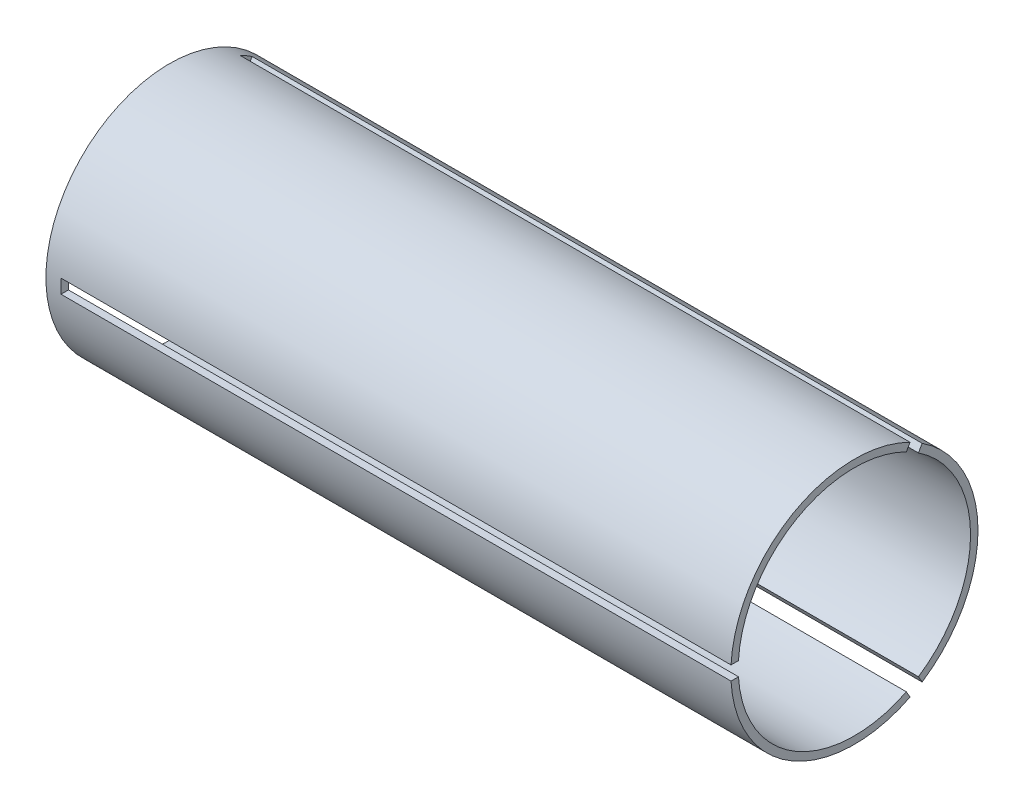
ISO-10303-21;
HEADER;
FILE_DESCRIPTION(('STEP AP214'),'2;1');
FILE_NAME('part.step','',(''),(''),'','','');
FILE_SCHEMA(('AUTOMOTIVE_DESIGN { 1 0 10303 214 1 1 1 1 }'));
ENDSEC;
DATA;
#1=APPLICATION_CONTEXT('core data for automotive mechanical design processes');
#2=APPLICATION_PROTOCOL_DEFINITION('international standard','automotive_design',2000,#1);
#3=PRODUCT_CONTEXT('',#1,'mechanical');
#4=PRODUCT('Part','Part','',(#3));
#5=PRODUCT_RELATED_PRODUCT_CATEGORY('part','',(#4));
#6=PRODUCT_DEFINITION_FORMATION('','',#4);
#7=PRODUCT_DEFINITION_CONTEXT('part definition',#1,'design');
#8=PRODUCT_DEFINITION('design','',#6,#7);
#9=PRODUCT_DEFINITION_SHAPE('','',#8);
#10=(LENGTH_UNIT() NAMED_UNIT(*) SI_UNIT(.MILLI.,.METRE.));
#11=(NAMED_UNIT(*) PLANE_ANGLE_UNIT() SI_UNIT($,.RADIAN.));
#12=(NAMED_UNIT(*) SI_UNIT($,.STERADIAN.) SOLID_ANGLE_UNIT());
#13=UNCERTAINTY_MEASURE_WITH_UNIT(LENGTH_MEASURE(1.E-05),#10,'distance_accuracy_value','');
#14=(GEOMETRIC_REPRESENTATION_CONTEXT(3) GLOBAL_UNCERTAINTY_ASSIGNED_CONTEXT((#13)) GLOBAL_UNIT_ASSIGNED_CONTEXT((#10,
#11,#12)) REPRESENTATION_CONTEXT('',''));
#15=CARTESIAN_POINT('',(0.,0.,0.));
#16=DIRECTION('',(0.,0.,1.));
#17=DIRECTION('',(1.,0.,0.));
#18=AXIS2_PLACEMENT_3D('',#15,#16,#17);
#19=CARTESIAN_POINT('',(233.68,0.,0.));
#20=DIRECTION('',(1.,0.,0.));
#21=DIRECTION('',(0.,0.,-1.));
#22=AXIS2_PLACEMENT_3D('',#19,#20,#21);
#23=PLANE('',#22);
#24=CARTESIAN_POINT('',(233.68,0.,0.));
#25=DIRECTION('',(1.,0.,0.));
#26=DIRECTION('',(0.,0.,-1.));
#27=AXIS2_PLACEMENT_3D('',#24,#25,#26);
#28=CIRCLE('',#27,39.624);
#29=CARTESIAN_POINT('',(233.68,-33.0627437150347,-21.8384146410387));
#30=VERTEX_POINT('',#29);
#31=CARTESIAN_POINT('',(233.68,33.062743715035,-21.8384146410382));
#32=VERTEX_POINT('',#31);
#33=EDGE_CURVE('E261',#30,#32,#28,.T.);
#34=ORIENTED_EDGE('',*,*,#33,.F.);
#35=DIRECTION('',(0.,0.866025403784436,0.500000000000004));
#36=VECTOR('',#35,1.);
#37=CARTESIAN_POINT('',(233.68,-48.6899225625834,-30.8607705553455));
#38=LINE('',#37,#36);
#39=CARTESIAN_POINT('',(233.68,-35.2661906635782,-23.1105753299253));
#40=VERTEX_POINT('',#39);
#41=EDGE_CURVE('E222',#40,#30,#38,.T.);
#42=ORIENTED_EDGE('',*,*,#41,.F.);
#43=CARTESIAN_POINT('',(233.68,0.,0.));
#44=DIRECTION('',(1.,0.,0.));
#45=DIRECTION('',(0.,0.,-1.));
#46=AXIS2_PLACEMENT_3D('',#43,#44,#45);
#47=CIRCLE('',#46,42.164);
#48=CARTESIAN_POINT('',(233.68,35.2661906635785,-23.1105753299248));
#49=VERTEX_POINT('',#48);
#50=EDGE_CURVE('E160',#40,#49,#47,.T.);
#51=ORIENTED_EDGE('',*,*,#50,.T.);
#52=DIRECTION('',(0.,-0.866025403784443,0.499999999999992));
#53=VECTOR('',#52,1.);
#54=CARTESIAN_POINT('',(233.68,48.6899225625837,-30.8607705553447));
#55=LINE('',#54,#53);
#56=EDGE_CURVE('E153',#49,#32,#55,.T.);
#57=ORIENTED_EDGE('',*,*,#56,.T.);
#58=EDGE_LOOP('',(#34,#42,#51,#57));
#59=FACE_BOUND('',#58,.T.);
#60=ADVANCED_FACE('F45',(#59),#23,.T.);
#61=CARTESIAN_POINT('',(233.68,-2.38125000000001,42.096704674327));
#62=VERTEX_POINT('',#61);
#63=CARTESIAN_POINT('',(233.68,-37.6474406635782,-18.986129344402));
#64=VERTEX_POINT('',#63);
#65=EDGE_CURVE('E163',#62,#64,#47,.T.);
#66=ORIENTED_EDGE('',*,*,#65,.T.);
#67=DIRECTION('',(0.,0.866025403784436,0.500000000000004));
#68=VECTOR('',#67,1.);
#69=CARTESIAN_POINT('',(233.68,-51.0711725625835,-26.7363245698221));
#70=LINE('',#69,#68);
#71=CARTESIAN_POINT('',(233.68,-35.4439937150347,-17.7139686555153));
#72=VERTEX_POINT('',#71);
#73=EDGE_CURVE('E284',#64,#72,#70,.T.);
#74=ORIENTED_EDGE('',*,*,#73,.T.);
#75=CARTESIAN_POINT('',(233.68,-2.38125000000001,39.5523832965537));
#76=VERTEX_POINT('',#75);
#77=EDGE_CURVE('E168',#76,#72,#28,.T.);
#78=ORIENTED_EDGE('',*,*,#77,.F.);
#79=DIRECTION('',(0.,0.,-1.));
#80=VECTOR('',#79,1.);
#81=CARTESIAN_POINT('',(233.68,-2.38125000000001,42.164));
#82=LINE('',#81,#80);
#83=EDGE_CURVE('E240',#62,#76,#82,.T.);
#84=ORIENTED_EDGE('',*,*,#83,.F.);
#85=EDGE_LOOP('',(#66,#74,#78,#84));
#86=FACE_BOUND('',#85,.T.);
#87=ADVANCED_FACE('F305',(#86),#23,.T.);
#88=CARTESIAN_POINT('',(233.68,35.443993715035,-17.7139686555148));
#89=VERTEX_POINT('',#88);
#90=CARTESIAN_POINT('',(233.68,2.38124999999999,39.5523832965537));
#91=VERTEX_POINT('',#90);
#92=EDGE_CURVE('E151',#89,#91,#28,.T.);
#93=ORIENTED_EDGE('',*,*,#92,.F.);
#94=DIRECTION('',(0.,-0.866025403784443,0.499999999999992));
#95=VECTOR('',#94,1.);
#96=CARTESIAN_POINT('',(233.68,51.0711725625837,-26.7363245698213));
#97=LINE('',#96,#95);
#98=CARTESIAN_POINT('',(233.68,37.6474406635784,-18.9861293444014));
#99=VERTEX_POINT('',#98);
#100=EDGE_CURVE('E69',#99,#89,#97,.T.);
#101=ORIENTED_EDGE('',*,*,#100,.F.);
#102=CARTESIAN_POINT('',(233.68,2.38124999999999,42.096704674327));
#103=VERTEX_POINT('',#102);
#104=EDGE_CURVE('E149',#99,#103,#47,.T.);
#105=ORIENTED_EDGE('',*,*,#104,.T.);
#106=DIRECTION('',(0.,0.,-1.));
#107=VECTOR('',#106,1.);
#108=CARTESIAN_POINT('',(233.68,2.38124999999999,42.164));
#109=LINE('',#108,#107);
#110=EDGE_CURVE('E237',#103,#91,#109,.T.);
#111=ORIENTED_EDGE('',*,*,#110,.T.);
#112=EDGE_LOOP('',(#93,#101,#105,#111));
#113=FACE_BOUND('',#112,.T.);
#114=ADVANCED_FACE('F147',(#113),#23,.T.);
#115=CARTESIAN_POINT('',(233.68,0.,0.));
#116=DIRECTION('',(-1.,0.,0.));
#117=DIRECTION('',(0.,0.,1.));
#118=AXIS2_PLACEMENT_3D('',#115,#116,#117);
#119=CYLINDRICAL_SURFACE('',#118,42.164);
#120=CARTESIAN_POINT('',(0.,0.,0.));
#121=DIRECTION('',(1.,0.,0.));
#122=DIRECTION('',(0.,0.,-1.));
#123=AXIS2_PLACEMENT_3D('',#120,#121,#122);
#124=CIRCLE('',#123,42.164);
#125=CARTESIAN_POINT('',(0.,0.,-42.164));
#126=VERTEX_POINT('',#125);
#127=EDGE_CURVE('E161',#126,#126,#124,.T.);
#128=ORIENTED_EDGE('',*,*,#127,.T.);
#129=EDGE_LOOP('',(#128));
#130=FACE_BOUND('',#129,.T.);
#131=DIRECTION('',(-1.,0.,0.));
#132=VECTOR('',#131,1.);
#133=CARTESIAN_POINT('',(233.68,-35.2661906635782,-23.1105753299253));
#134=LINE('',#133,#132);
#135=CARTESIAN_POINT('',(5.07999999999997,-35.2661906635781,-23.1105753299254));
#136=VERTEX_POINT('',#135);
#137=EDGE_CURVE('E234',#136,#40,#134,.F.);
#138=ORIENTED_EDGE('',*,*,#137,.F.);
#139=CARTESIAN_POINT('',(5.07999999999997,0.,0.));
#140=DIRECTION('',(1.,0.,0.));
#141=DIRECTION('',(0.,0.,-1.));
#142=AXIS2_PLACEMENT_3D('',#139,#140,#141);
#143=CIRCLE('',#142,42.164);
#144=CARTESIAN_POINT('',(5.07999999999997,-37.6474406635782,-18.986129344402));
#145=VERTEX_POINT('',#144);
#146=EDGE_CURVE('E228',#145,#136,#143,.T.);
#147=ORIENTED_EDGE('',*,*,#146,.F.);
#148=DIRECTION('',(-1.,0.,0.));
#149=VECTOR('',#148,1.);
#150=CARTESIAN_POINT('',(233.68,-37.6474406635782,-18.986129344402));
#151=LINE('',#150,#149);
#152=EDGE_CURVE('E218',#64,#145,#151,.T.);
#153=ORIENTED_EDGE('',*,*,#152,.F.);
#154=ORIENTED_EDGE('',*,*,#65,.F.);
#155=DIRECTION('',(-1.,0.,0.));
#156=VECTOR('',#155,1.);
#157=CARTESIAN_POINT('',(233.68,-2.38125000000001,42.096704674327));
#158=LINE('',#157,#156);
#159=CARTESIAN_POINT('',(5.07999999999997,-2.38125000000003,42.096704674327));
#160=VERTEX_POINT('',#159);
#161=EDGE_CURVE('E251',#160,#62,#158,.F.);
#162=ORIENTED_EDGE('',*,*,#161,.F.);
#163=CARTESIAN_POINT('',(5.07999999999997,0.,0.));
#164=DIRECTION('',(1.,0.,0.));
#165=DIRECTION('',(0.,0.,-1.));
#166=AXIS2_PLACEMENT_3D('',#163,#164,#165);
#167=CIRCLE('',#166,42.164);
#168=CARTESIAN_POINT('',(5.07999999999997,2.38124999999997,42.096704674327));
#169=VERTEX_POINT('',#168);
#170=EDGE_CURVE('E254',#169,#160,#167,.T.);
#171=ORIENTED_EDGE('',*,*,#170,.F.);
#172=DIRECTION('',(-1.,0.,0.));
#173=VECTOR('',#172,1.);
#174=CARTESIAN_POINT('',(233.68,2.38124999999999,42.096704674327));
#175=LINE('',#174,#173);
#176=EDGE_CURVE('E158',#103,#169,#175,.T.);
#177=ORIENTED_EDGE('',*,*,#176,.F.);
#178=ORIENTED_EDGE('',*,*,#104,.F.);
#179=DIRECTION('',(-1.,0.,0.));
#180=VECTOR('',#179,1.);
#181=CARTESIAN_POINT('',(233.68,37.6474406635784,-18.9861293444014));
#182=LINE('',#181,#180);
#183=CARTESIAN_POINT('',(5.07999999999997,37.6474406635785,-18.9861293444014));
#184=VERTEX_POINT('',#183);
#185=EDGE_CURVE('E134',#184,#99,#182,.F.);
#186=ORIENTED_EDGE('',*,*,#185,.F.);
#187=CARTESIAN_POINT('',(5.07999999999997,35.2661906635785,-23.1105753299248));
#188=VERTEX_POINT('',#187);
#189=EDGE_CURVE('E231',#188,#184,#143,.T.);
#190=ORIENTED_EDGE('',*,*,#189,.F.);
#191=DIRECTION('',(-1.,0.,0.));
#192=VECTOR('',#191,1.);
#193=CARTESIAN_POINT('',(233.68,35.2661906635785,-23.1105753299248));
#194=LINE('',#193,#192);
#195=EDGE_CURVE('E142',#49,#188,#194,.T.);
#196=ORIENTED_EDGE('',*,*,#195,.F.);
#197=ORIENTED_EDGE('',*,*,#50,.F.);
#198=EDGE_LOOP('',(#138,#147,#153,#154,#162,#171,#177,#178,#186,#190,#196,#197));
#199=FACE_BOUND('',#198,.T.);
#200=ADVANCED_FACE('F47',(#130,#199),#119,.T.);
#201=CARTESIAN_POINT('',(233.68,0.,0.));
#202=DIRECTION('',(-1.,0.,0.));
#203=DIRECTION('',(0.,0.,1.));
#204=AXIS2_PLACEMENT_3D('',#201,#202,#203);
#205=CYLINDRICAL_SURFACE('',#204,39.624);
#206=CARTESIAN_POINT('',(0.,0.,0.));
#207=DIRECTION('',(1.,0.,0.));
#208=DIRECTION('',(0.,0.,-1.));
#209=AXIS2_PLACEMENT_3D('',#206,#207,#208);
#210=CIRCLE('',#209,39.624);
#211=CARTESIAN_POINT('',(0.,0.,-39.624));
#212=VERTEX_POINT('',#211);
#213=EDGE_CURVE('E259',#212,#212,#210,.T.);
#214=ORIENTED_EDGE('',*,*,#213,.F.);
#215=EDGE_LOOP('',(#214));
#216=FACE_BOUND('',#215,.T.);
#217=CARTESIAN_POINT('',(5.07999999999997,0.,0.));
#218=DIRECTION('',(1.,0.,0.));
#219=DIRECTION('',(0.,0.,-1.));
#220=AXIS2_PLACEMENT_3D('',#217,#218,#219);
#221=CIRCLE('',#220,39.624);
#222=CARTESIAN_POINT('',(5.07999999999997,-35.4439937150347,-17.7139686555154));
#223=VERTEX_POINT('',#222);
#224=CARTESIAN_POINT('',(5.07999999999997,-33.0627437150347,-21.8384146410387));
#225=VERTEX_POINT('',#224);
#226=EDGE_CURVE('E201',#223,#225,#221,.T.);
#227=ORIENTED_EDGE('',*,*,#226,.T.);
#228=DIRECTION('',(-1.,0.,0.));
#229=VECTOR('',#228,1.);
#230=CARTESIAN_POINT('',(233.68,-33.0627437150347,-21.8384146410387));
#231=LINE('',#230,#229);
#232=EDGE_CURVE('E11',#225,#30,#231,.F.);
#233=ORIENTED_EDGE('',*,*,#232,.T.);
#234=ORIENTED_EDGE('',*,*,#33,.T.);
#235=DIRECTION('',(-1.,0.,0.));
#236=VECTOR('',#235,1.);
#237=CARTESIAN_POINT('',(233.68,33.062743715035,-21.8384146410382));
#238=LINE('',#237,#236);
#239=CARTESIAN_POINT('',(5.07999999999997,33.062743715035,-21.8384146410382));
#240=VERTEX_POINT('',#239);
#241=EDGE_CURVE('E200',#32,#240,#238,.T.);
#242=ORIENTED_EDGE('',*,*,#241,.T.);
#243=CARTESIAN_POINT('',(5.07999999999997,35.443993715035,-17.7139686555148));
#244=VERTEX_POINT('',#243);
#245=EDGE_CURVE('E196',#240,#244,#221,.T.);
#246=ORIENTED_EDGE('',*,*,#245,.T.);
#247=DIRECTION('',(-1.,0.,0.));
#248=VECTOR('',#247,1.);
#249=CARTESIAN_POINT('',(233.68,35.443993715035,-17.7139686555148));
#250=LINE('',#249,#248);
#251=EDGE_CURVE('E193',#244,#89,#250,.F.);
#252=ORIENTED_EDGE('',*,*,#251,.T.);
#253=ORIENTED_EDGE('',*,*,#92,.T.);
#254=DIRECTION('',(-1.,0.,0.));
#255=VECTOR('',#254,1.);
#256=CARTESIAN_POINT('',(233.68,2.38124999999999,39.5523832965537));
#257=LINE('',#256,#255);
#258=CARTESIAN_POINT('',(5.07999999999997,2.38124999999997,39.5523832965537));
#259=VERTEX_POINT('',#258);
#260=EDGE_CURVE('E187',#91,#259,#257,.T.);
#261=ORIENTED_EDGE('',*,*,#260,.T.);
#262=CARTESIAN_POINT('',(5.07999999999997,0.,0.));
#263=DIRECTION('',(1.,0.,0.));
#264=DIRECTION('',(0.,0.,-1.));
#265=AXIS2_PLACEMENT_3D('',#262,#263,#264);
#266=CIRCLE('',#265,39.624);
#267=CARTESIAN_POINT('',(5.07999999999997,-2.38125000000003,39.5523832965537));
#268=VERTEX_POINT('',#267);
#269=EDGE_CURVE('E180',#259,#268,#266,.T.);
#270=ORIENTED_EDGE('',*,*,#269,.T.);
#271=DIRECTION('',(-1.,0.,0.));
#272=VECTOR('',#271,1.);
#273=CARTESIAN_POINT('',(233.68,-2.38125000000001,39.5523832965537));
#274=LINE('',#273,#272);
#275=EDGE_CURVE('E173',#268,#76,#274,.F.);
#276=ORIENTED_EDGE('',*,*,#275,.T.);
#277=ORIENTED_EDGE('',*,*,#77,.T.);
#278=DIRECTION('',(-1.,0.,0.));
#279=VECTOR('',#278,1.);
#280=CARTESIAN_POINT('',(233.68,-35.4439937150347,-17.7139686555153));
#281=LINE('',#280,#279);
#282=EDGE_CURVE('E54',#72,#223,#281,.T.);
#283=ORIENTED_EDGE('',*,*,#282,.T.);
#284=EDGE_LOOP('',(#227,#233,#234,#242,#246,#252,#253,#261,#270,#276,#277,#283));
#285=FACE_BOUND('',#284,.T.);
#286=ADVANCED_FACE('F208',(#216,#285),#205,.F.);
#287=CARTESIAN_POINT('',(0.,0.,0.));
#288=DIRECTION('',(1.,0.,0.));
#289=DIRECTION('',(0.,0.,-1.));
#290=AXIS2_PLACEMENT_3D('',#287,#288,#289);
#291=PLANE('',#290);
#292=ORIENTED_EDGE('',*,*,#127,.F.);
#293=EDGE_LOOP('',(#292));
#294=FACE_BOUND('',#293,.T.);
#295=ORIENTED_EDGE('',*,*,#213,.T.);
#296=EDGE_LOOP('',(#295));
#297=FACE_BOUND('',#296,.T.);
#298=ADVANCED_FACE('F320',(#294,#297),#291,.F.);
#299=CARTESIAN_POINT('',(5.07999999999997,2.38124999999997,42.164));
#300=DIRECTION('',(0.,-1.,0.));
#301=DIRECTION('',(1.,0.,0.));
#302=AXIS2_PLACEMENT_3D('',#299,#300,#301);
#303=PLANE('',#302);
#304=ORIENTED_EDGE('',*,*,#176,.T.);
#305=DIRECTION('',(0.,0.,-1.));
#306=VECTOR('',#305,1.);
#307=CARTESIAN_POINT('',(5.07999999999997,2.38124999999997,42.164));
#308=LINE('',#307,#306);
#309=EDGE_CURVE('E247',#169,#259,#308,.T.);
#310=ORIENTED_EDGE('',*,*,#309,.T.);
#311=ORIENTED_EDGE('',*,*,#260,.F.);
#312=ORIENTED_EDGE('',*,*,#110,.F.);
#313=EDGE_LOOP('',(#304,#310,#311,#312));
#314=FACE_BOUND('',#313,.T.);
#315=ADVANCED_FACE('F325',(#314),#303,.T.);
#316=CARTESIAN_POINT('',(5.07999999999997,-2.38125000000003,42.164));
#317=DIRECTION('',(1.,0.,0.));
#318=DIRECTION('',(0.,0.,-1.));
#319=AXIS2_PLACEMENT_3D('',#316,#317,#318);
#320=PLANE('',#319);
#321=ORIENTED_EDGE('',*,*,#170,.T.);
#322=DIRECTION('',(0.,0.,-1.));
#323=VECTOR('',#322,1.);
#324=CARTESIAN_POINT('',(5.07999999999997,-2.38125000000003,42.164));
#325=LINE('',#324,#323);
#326=EDGE_CURVE('E243',#160,#268,#325,.T.);
#327=ORIENTED_EDGE('',*,*,#326,.T.);
#328=ORIENTED_EDGE('',*,*,#269,.F.);
#329=ORIENTED_EDGE('',*,*,#309,.F.);
#330=EDGE_LOOP('',(#321,#327,#328,#329));
#331=FACE_BOUND('',#330,.T.);
#332=ADVANCED_FACE('F329',(#331),#320,.T.);
#333=CARTESIAN_POINT('',(5.07999999999997,-2.38125000000003,42.164));
#334=DIRECTION('',(0.,1.,0.));
#335=DIRECTION('',(-1.,0.,0.));
#336=AXIS2_PLACEMENT_3D('',#333,#334,#335);
#337=PLANE('',#336);
#338=ORIENTED_EDGE('',*,*,#161,.T.);
#339=ORIENTED_EDGE('',*,*,#83,.T.);
#340=ORIENTED_EDGE('',*,*,#275,.F.);
#341=ORIENTED_EDGE('',*,*,#326,.F.);
#342=EDGE_LOOP('',(#338,#339,#340,#341));
#343=FACE_BOUND('',#342,.T.);
#344=ADVANCED_FACE('F335',(#343),#337,.T.);
#345=CARTESIAN_POINT('',(5.07999999999997,51.0711725625837,-26.7363245698213));
#346=DIRECTION('',(0.,-0.499999999999992,-0.866025403784443));
#347=DIRECTION('',(0.,0.866025403784443,-0.499999999999992));
#348=AXIS2_PLACEMENT_3D('',#345,#346,#347);
#349=PLANE('',#348);
#350=ORIENTED_EDGE('',*,*,#185,.T.);
#351=ORIENTED_EDGE('',*,*,#100,.T.);
#352=ORIENTED_EDGE('',*,*,#251,.F.);
#353=DIRECTION('',(0.,-0.866025403784443,0.499999999999992));
#354=VECTOR('',#353,1.);
#355=CARTESIAN_POINT('',(5.07999999999997,51.0711725625837,-26.7363245698213));
#356=LINE('',#355,#354);
#357=EDGE_CURVE('E137',#184,#244,#356,.T.);
#358=ORIENTED_EDGE('',*,*,#357,.F.);
#359=EDGE_LOOP('',(#350,#351,#352,#358));
#360=FACE_BOUND('',#359,.T.);
#361=ADVANCED_FACE('F135',(#360),#349,.T.);
#362=CARTESIAN_POINT('',(5.07999999999997,48.6899225625837,-30.8607705553447));
#363=DIRECTION('',(0.,0.499999999999992,0.866025403784443));
#364=DIRECTION('',(0.,-0.866025403784443,0.499999999999992));
#365=AXIS2_PLACEMENT_3D('',#362,#363,#364);
#366=PLANE('',#365);
#367=ORIENTED_EDGE('',*,*,#195,.T.);
#368=DIRECTION('',(0.,-0.866025403784443,0.499999999999992));
#369=VECTOR('',#368,1.);
#370=CARTESIAN_POINT('',(5.07999999999997,48.6899225625837,-30.8607705553447));
#371=LINE('',#370,#369);
#372=EDGE_CURVE('E280',#188,#240,#371,.T.);
#373=ORIENTED_EDGE('',*,*,#372,.T.);
#374=ORIENTED_EDGE('',*,*,#241,.F.);
#375=ORIENTED_EDGE('',*,*,#56,.F.);
#376=EDGE_LOOP('',(#367,#373,#374,#375));
#377=FACE_BOUND('',#376,.T.);
#378=ADVANCED_FACE('F290',(#377),#366,.T.);
#379=CARTESIAN_POINT('',(5.07999999999997,-48.6899225625834,-30.8607705553455));
#380=DIRECTION('',(1.,0.,0.));
#381=DIRECTION('',(0.,0.,-1.));
#382=AXIS2_PLACEMENT_3D('',#379,#380,#381);
#383=PLANE('',#382);
#384=ORIENTED_EDGE('',*,*,#189,.T.);
#385=ORIENTED_EDGE('',*,*,#357,.T.);
#386=ORIENTED_EDGE('',*,*,#245,.F.);
#387=ORIENTED_EDGE('',*,*,#372,.F.);
#388=EDGE_LOOP('',(#384,#385,#386,#387));
#389=FACE_BOUND('',#388,.T.);
#390=ADVANCED_FACE('F292',(#389),#383,.T.);
#391=CARTESIAN_POINT('',(5.07999999999997,-48.6899225625834,-30.8607705553455));
#392=DIRECTION('',(0.,-0.500000000000004,0.866025403784436));
#393=DIRECTION('',(0.,-0.866025403784436,-0.500000000000004));
#394=AXIS2_PLACEMENT_3D('',#391,#392,#393);
#395=PLANE('',#394);
#396=ORIENTED_EDGE('',*,*,#137,.T.);
#397=ORIENTED_EDGE('',*,*,#41,.T.);
#398=ORIENTED_EDGE('',*,*,#232,.F.);
#399=DIRECTION('',(0.,0.866025403784436,0.500000000000004));
#400=VECTOR('',#399,1.);
#401=CARTESIAN_POINT('',(5.07999999999997,-48.6899225625834,-30.8607705553455));
#402=LINE('',#401,#400);
#403=EDGE_CURVE('E61',#136,#225,#402,.T.);
#404=ORIENTED_EDGE('',*,*,#403,.F.);
#405=EDGE_LOOP('',(#396,#397,#398,#404));
#406=FACE_BOUND('',#405,.T.);
#407=ADVANCED_FACE('F288',(#406),#395,.T.);
#408=CARTESIAN_POINT('',(5.07999999999997,-51.0711725625835,-26.7363245698221));
#409=DIRECTION('',(0.,0.500000000000004,-0.866025403784436));
#410=DIRECTION('',(0.,0.866025403784436,0.500000000000004));
#411=AXIS2_PLACEMENT_3D('',#408,#409,#410);
#412=PLANE('',#411);
#413=ORIENTED_EDGE('',*,*,#152,.T.);
#414=DIRECTION('',(0.,0.866025403784436,0.500000000000004));
#415=VECTOR('',#414,1.);
#416=CARTESIAN_POINT('',(5.07999999999997,-51.0711725625835,-26.7363245698221));
#417=LINE('',#416,#415);
#418=EDGE_CURVE('E143',#145,#223,#417,.T.);
#419=ORIENTED_EDGE('',*,*,#418,.T.);
#420=ORIENTED_EDGE('',*,*,#282,.F.);
#421=ORIENTED_EDGE('',*,*,#73,.F.);
#422=EDGE_LOOP('',(#413,#419,#420,#421));
#423=FACE_BOUND('',#422,.T.);
#424=ADVANCED_FACE('F216',(#423),#412,.T.);
#425=ORIENTED_EDGE('',*,*,#146,.T.);
#426=ORIENTED_EDGE('',*,*,#403,.T.);
#427=ORIENTED_EDGE('',*,*,#226,.F.);
#428=ORIENTED_EDGE('',*,*,#418,.F.);
#429=EDGE_LOOP('',(#425,#426,#427,#428));
#430=FACE_BOUND('',#429,.T.);
#431=ADVANCED_FACE('F213',(#430),#383,.T.);
#432=CLOSED_SHELL('',(#60,#87,#114,#200,#286,#298,#315,#332,#344,#361,#378,#390,#407,#424,#431));
#433=MANIFOLD_SOLID_BREP('B2',#432);
#434=ADVANCED_BREP_SHAPE_REPRESENTATION('',(#18,#433),#14);
#435=SHAPE_DEFINITION_REPRESENTATION(#9,#434);
ENDSEC;
END-ISO-10303-21;
